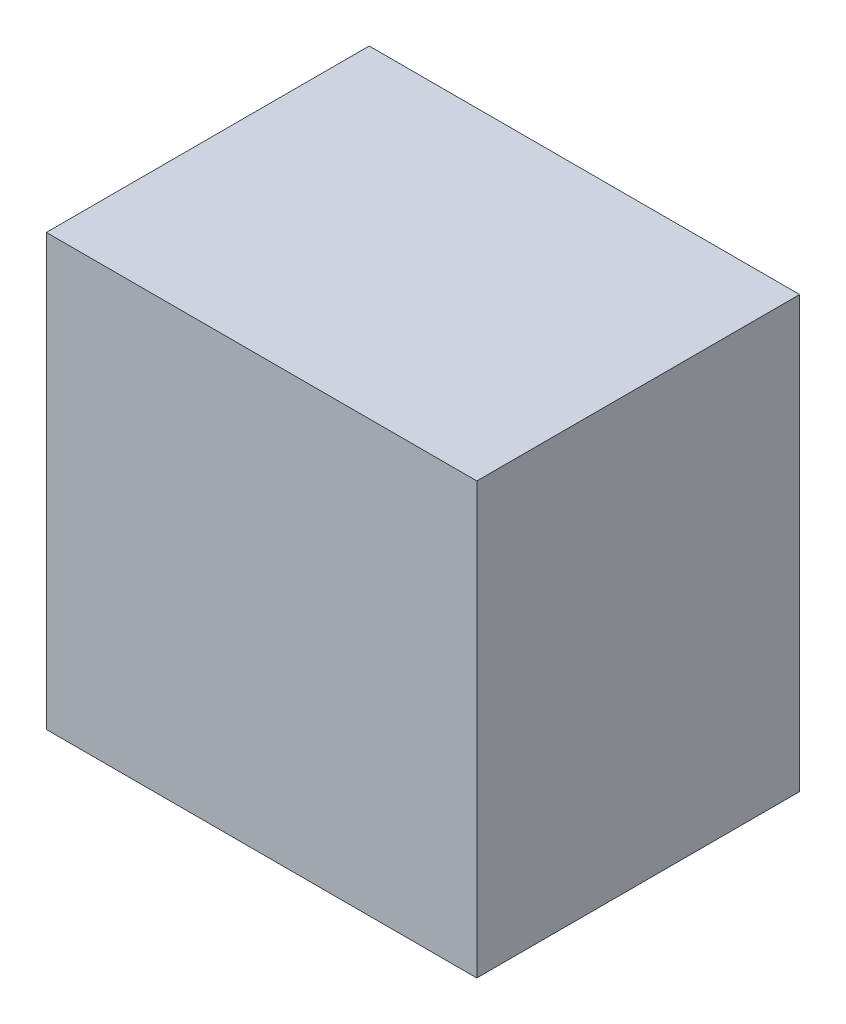
ISO-10303-21;
HEADER;
FILE_DESCRIPTION(('STEP AP214'),'2;1');
FILE_NAME('part.step','',(''),(''),'','','');
FILE_SCHEMA(('AUTOMOTIVE_DESIGN { 1 0 10303 214 1 1 1 1 }'));
ENDSEC;
DATA;
#1=APPLICATION_CONTEXT('core data for automotive mechanical design processes');
#2=APPLICATION_PROTOCOL_DEFINITION('international standard','automotive_design',2000,#1);
#3=PRODUCT_CONTEXT('',#1,'mechanical');
#4=PRODUCT('Part','Part','',(#3));
#5=PRODUCT_RELATED_PRODUCT_CATEGORY('part','',(#4));
#6=PRODUCT_DEFINITION_FORMATION('','',#4);
#7=PRODUCT_DEFINITION_CONTEXT('part definition',#1,'design');
#8=PRODUCT_DEFINITION('design','',#6,#7);
#9=PRODUCT_DEFINITION_SHAPE('','',#8);
#10=(LENGTH_UNIT() NAMED_UNIT(*) SI_UNIT(.MILLI.,.METRE.));
#11=(NAMED_UNIT(*) PLANE_ANGLE_UNIT() SI_UNIT($,.RADIAN.));
#12=(NAMED_UNIT(*) SI_UNIT($,.STERADIAN.) SOLID_ANGLE_UNIT());
#13=UNCERTAINTY_MEASURE_WITH_UNIT(LENGTH_MEASURE(1.E-05),#10,'distance_accuracy_value','');
#14=(GEOMETRIC_REPRESENTATION_CONTEXT(3) GLOBAL_UNCERTAINTY_ASSIGNED_CONTEXT((#13)) GLOBAL_UNIT_ASSIGNED_CONTEXT((#10,
#11,#12)) REPRESENTATION_CONTEXT('',''));
#15=CARTESIAN_POINT('',(0.,0.,0.));
#16=DIRECTION('',(0.,0.,1.));
#17=DIRECTION('',(1.,0.,0.));
#18=AXIS2_PLACEMENT_3D('',#15,#16,#17);
#19=CARTESIAN_POINT('',(-1000.,2000.,-750.));
#20=DIRECTION('',(1.,0.,0.));
#21=DIRECTION('',(0.,0.,-1.));
#22=AXIS2_PLACEMENT_3D('',#19,#20,#21);
#23=PLANE('',#22);
#24=DIRECTION('',(0.,0.,1.));
#25=VECTOR('',#24,1.);
#26=CARTESIAN_POINT('',(-1000.,0.,-750.));
#27=LINE('',#26,#25);
#28=CARTESIAN_POINT('',(-1000.,0.,-750.));
#29=VERTEX_POINT('',#28);
#30=CARTESIAN_POINT('',(-1000.,0.,750.));
#31=VERTEX_POINT('',#30);
#32=EDGE_CURVE('E107',#29,#31,#27,.T.);
#33=ORIENTED_EDGE('',*,*,#32,.T.);
#34=DIRECTION('',(0.,-1.,0.));
#35=VECTOR('',#34,1.);
#36=CARTESIAN_POINT('',(-1000.,2000.,750.));
#37=LINE('',#36,#35);
#38=CARTESIAN_POINT('',(-1000.,2000.,750.));
#39=VERTEX_POINT('',#38);
#40=EDGE_CURVE('E11',#39,#31,#37,.T.);
#41=ORIENTED_EDGE('',*,*,#40,.F.);
#42=DIRECTION('',(0.,0.,1.));
#43=VECTOR('',#42,1.);
#44=CARTESIAN_POINT('',(-1000.,2000.,-750.));
#45=LINE('',#44,#43);
#46=CARTESIAN_POINT('',(-1000.,2000.,-750.));
#47=VERTEX_POINT('',#46);
#48=EDGE_CURVE('E91',#47,#39,#45,.T.);
#49=ORIENTED_EDGE('',*,*,#48,.F.);
#50=DIRECTION('',(0.,-1.,0.));
#51=VECTOR('',#50,1.);
#52=CARTESIAN_POINT('',(-1000.,2000.,-750.));
#53=LINE('',#52,#51);
#54=EDGE_CURVE('E103',#47,#29,#53,.T.);
#55=ORIENTED_EDGE('',*,*,#54,.T.);
#56=EDGE_LOOP('',(#33,#41,#49,#55));
#57=FACE_BOUND('',#56,.T.);
#58=ADVANCED_FACE('F39',(#57),#23,.F.);
#59=CARTESIAN_POINT('',(-1000.,2000.,750.));
#60=DIRECTION('',(0.,0.,-1.));
#61=DIRECTION('',(-1.,0.,0.));
#62=AXIS2_PLACEMENT_3D('',#59,#60,#61);
#63=PLANE('',#62);
#64=DIRECTION('',(1.,0.,0.));
#65=VECTOR('',#64,1.);
#66=CARTESIAN_POINT('',(-1000.,0.,750.));
#67=LINE('',#66,#65);
#68=CARTESIAN_POINT('',(1000.,0.,750.));
#69=VERTEX_POINT('',#68);
#70=EDGE_CURVE('E96',#31,#69,#67,.T.);
#71=ORIENTED_EDGE('',*,*,#70,.T.);
#72=DIRECTION('',(0.,-1.,0.));
#73=VECTOR('',#72,1.);
#74=CARTESIAN_POINT('',(1000.,2000.,750.));
#75=LINE('',#74,#73);
#76=CARTESIAN_POINT('',(1000.,2000.,750.));
#77=VERTEX_POINT('',#76);
#78=EDGE_CURVE('E48',#77,#69,#75,.T.);
#79=ORIENTED_EDGE('',*,*,#78,.F.);
#80=DIRECTION('',(1.,0.,0.));
#81=VECTOR('',#80,1.);
#82=CARTESIAN_POINT('',(-1000.,2000.,750.));
#83=LINE('',#82,#81);
#84=EDGE_CURVE('E86',#39,#77,#83,.T.);
#85=ORIENTED_EDGE('',*,*,#84,.F.);
#86=ORIENTED_EDGE('',*,*,#40,.T.);
#87=EDGE_LOOP('',(#71,#79,#85,#86));
#88=FACE_BOUND('',#87,.T.);
#89=ADVANCED_FACE('F95',(#88),#63,.F.);
#90=CARTESIAN_POINT('',(1000.,2000.,-750.));
#91=DIRECTION('',(-1.,0.,0.));
#92=DIRECTION('',(0.,0.,1.));
#93=AXIS2_PLACEMENT_3D('',#90,#91,#92);
#94=PLANE('',#93);
#95=DIRECTION('',(0.,0.,-1.));
#96=VECTOR('',#95,1.);
#97=CARTESIAN_POINT('',(1000.,0.,-750.));
#98=LINE('',#97,#96);
#99=CARTESIAN_POINT('',(1000.,0.,-750.));
#100=VERTEX_POINT('',#99);
#101=EDGE_CURVE('E73',#69,#100,#98,.T.);
#102=ORIENTED_EDGE('',*,*,#101,.T.);
#103=DIRECTION('',(0.,-1.,0.));
#104=VECTOR('',#103,1.);
#105=CARTESIAN_POINT('',(1000.,2000.,-750.));
#106=LINE('',#105,#104);
#107=CARTESIAN_POINT('',(1000.,2000.,-750.));
#108=VERTEX_POINT('',#107);
#109=EDGE_CURVE('E98',#108,#100,#106,.T.);
#110=ORIENTED_EDGE('',*,*,#109,.F.);
#111=DIRECTION('',(0.,0.,-1.));
#112=VECTOR('',#111,1.);
#113=CARTESIAN_POINT('',(1000.,2000.,-750.));
#114=LINE('',#113,#112);
#115=EDGE_CURVE('E89',#77,#108,#114,.T.);
#116=ORIENTED_EDGE('',*,*,#115,.F.);
#117=ORIENTED_EDGE('',*,*,#78,.T.);
#118=EDGE_LOOP('',(#102,#110,#116,#117));
#119=FACE_BOUND('',#118,.T.);
#120=ADVANCED_FACE('F99',(#119),#94,.F.);
#121=CARTESIAN_POINT('',(-1000.,2000.,-750.));
#122=DIRECTION('',(0.,0.,1.));
#123=DIRECTION('',(1.,0.,0.));
#124=AXIS2_PLACEMENT_3D('',#121,#122,#123);
#125=PLANE('',#124);
#126=DIRECTION('',(-1.,0.,0.));
#127=VECTOR('',#126,1.);
#128=CARTESIAN_POINT('',(-1000.,0.,-750.));
#129=LINE('',#128,#127);
#130=EDGE_CURVE('E79',#100,#29,#129,.T.);
#131=ORIENTED_EDGE('',*,*,#130,.T.);
#132=ORIENTED_EDGE('',*,*,#54,.F.);
#133=DIRECTION('',(-1.,0.,0.));
#134=VECTOR('',#133,1.);
#135=CARTESIAN_POINT('',(-1000.,2000.,-750.));
#136=LINE('',#135,#134);
#137=EDGE_CURVE('E56',#108,#47,#136,.T.);
#138=ORIENTED_EDGE('',*,*,#137,.F.);
#139=ORIENTED_EDGE('',*,*,#109,.T.);
#140=EDGE_LOOP('',(#131,#132,#138,#139));
#141=FACE_BOUND('',#140,.T.);
#142=ADVANCED_FACE('F120',(#141),#125,.F.);
#143=CARTESIAN_POINT('',(0.,2000.,0.));
#144=DIRECTION('',(0.,1.,0.));
#145=DIRECTION('',(0.,0.,1.));
#146=AXIS2_PLACEMENT_3D('',#143,#144,#145);
#147=PLANE('',#146);
#148=ORIENTED_EDGE('',*,*,#48,.T.);
#149=ORIENTED_EDGE('',*,*,#84,.T.);
#150=ORIENTED_EDGE('',*,*,#115,.T.);
#151=ORIENTED_EDGE('',*,*,#137,.T.);
#152=EDGE_LOOP('',(#148,#149,#150,#151));
#153=FACE_BOUND('',#152,.T.);
#154=ADVANCED_FACE('F87',(#153),#147,.T.);
#155=CARTESIAN_POINT('',(0.,0.,0.));
#156=DIRECTION('',(0.,1.,0.));
#157=DIRECTION('',(0.,0.,1.));
#158=AXIS2_PLACEMENT_3D('',#155,#156,#157);
#159=PLANE('',#158);
#160=ORIENTED_EDGE('',*,*,#32,.F.);
#161=ORIENTED_EDGE('',*,*,#130,.F.);
#162=ORIENTED_EDGE('',*,*,#101,.F.);
#163=ORIENTED_EDGE('',*,*,#70,.F.);
#164=EDGE_LOOP('',(#160,#161,#162,#163));
#165=FACE_BOUND('',#164,.T.);
#166=ADVANCED_FACE('F123',(#165),#159,.F.);
#167=CLOSED_SHELL('',(#58,#89,#120,#142,#154,#166));
#168=MANIFOLD_SOLID_BREP('B2',#167);
#169=ADVANCED_BREP_SHAPE_REPRESENTATION('',(#18,#168),#14);
#170=SHAPE_DEFINITION_REPRESENTATION(#9,#169);
ENDSEC;
END-ISO-10303-21;
